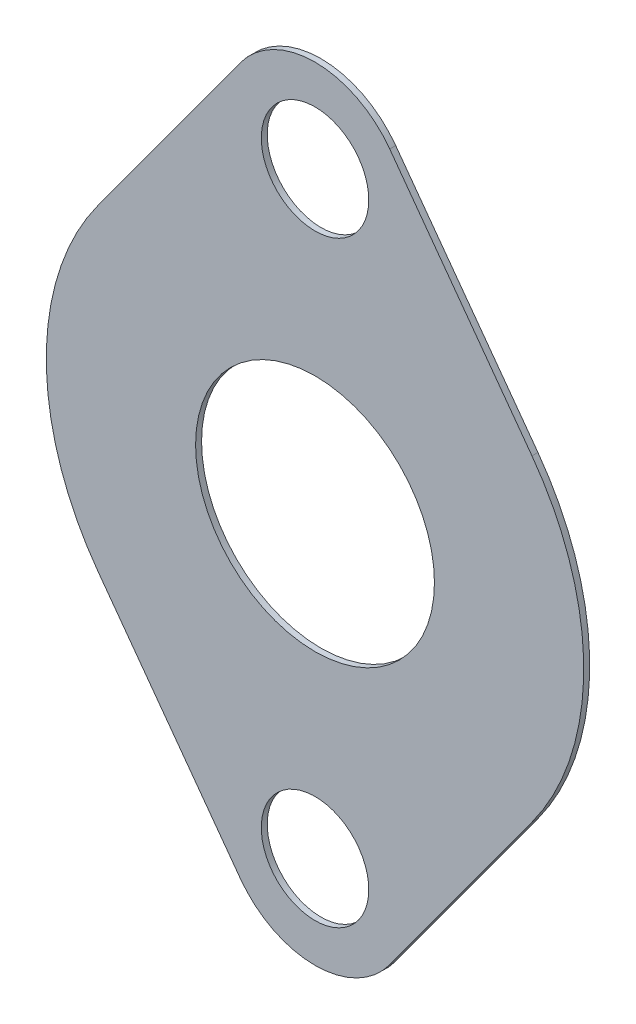
ISO-10303-21;
HEADER;
FILE_DESCRIPTION(('STEP AP214'),'2;1');
FILE_NAME('part.step','',(''),(''),'','','');
FILE_SCHEMA(('AUTOMOTIVE_DESIGN { 1 0 10303 214 1 1 1 1 }'));
ENDSEC;
DATA;
#1=APPLICATION_CONTEXT('core data for automotive mechanical design processes');
#2=APPLICATION_PROTOCOL_DEFINITION('international standard','automotive_design',2000,#1);
#3=PRODUCT_CONTEXT('',#1,'mechanical');
#4=PRODUCT('Part','Part','',(#3));
#5=PRODUCT_RELATED_PRODUCT_CATEGORY('part','',(#4));
#6=PRODUCT_DEFINITION_FORMATION('','',#4);
#7=PRODUCT_DEFINITION_CONTEXT('part definition',#1,'design');
#8=PRODUCT_DEFINITION('design','',#6,#7);
#9=PRODUCT_DEFINITION_SHAPE('','',#8);
#10=(LENGTH_UNIT() NAMED_UNIT(*) SI_UNIT(.MILLI.,.METRE.));
#11=(NAMED_UNIT(*) PLANE_ANGLE_UNIT() SI_UNIT($,.RADIAN.));
#12=(NAMED_UNIT(*) SI_UNIT($,.STERADIAN.) SOLID_ANGLE_UNIT());
#13=UNCERTAINTY_MEASURE_WITH_UNIT(LENGTH_MEASURE(1.E-05),#10,'distance_accuracy_value','');
#14=(GEOMETRIC_REPRESENTATION_CONTEXT(3) GLOBAL_UNCERTAINTY_ASSIGNED_CONTEXT((#13)) GLOBAL_UNIT_ASSIGNED_CONTEXT((#10,
#11,#12)) REPRESENTATION_CONTEXT('',''));
#15=CARTESIAN_POINT('',(0.,0.,0.));
#16=DIRECTION('',(0.,0.,1.));
#17=DIRECTION('',(1.,0.,0.));
#18=AXIS2_PLACEMENT_3D('',#15,#16,#17);
#19=CARTESIAN_POINT('',(0.,50.,1.));
#20=DIRECTION('',(0.,0.,1.));
#21=DIRECTION('',(1.,0.,0.));
#22=AXIS2_PLACEMENT_3D('',#19,#20,#21);
#23=PLANE('',#22);
#24=CARTESIAN_POINT('',(0.,-50.,1.));
#25=DIRECTION('',(0.,0.,1.));
#26=DIRECTION('',(1.,0.,0.));
#27=AXIS2_PLACEMENT_3D('',#24,#25,#26);
#28=CIRCLE('',#27,9.00000000000001);
#29=CARTESIAN_POINT('',(9.00000000000001,-50.,1.));
#30=VERTEX_POINT('',#29);
#31=EDGE_CURVE('E190',#30,#30,#28,.T.);
#32=ORIENTED_EDGE('',*,*,#31,.F.);
#33=EDGE_LOOP('',(#32));
#34=FACE_BOUND('',#33,.T.);
#35=CARTESIAN_POINT('',(0.,50.,1.));
#36=DIRECTION('',(0.,0.,1.));
#37=DIRECTION('',(1.,0.,0.));
#38=AXIS2_PLACEMENT_3D('',#35,#36,#37);
#39=CIRCLE('',#38,15.5);
#40=CARTESIAN_POINT('',(12.5147502971494,59.145,1.));
#41=VERTEX_POINT('',#40);
#42=CARTESIAN_POINT('',(-12.5147502971494,59.145,1.));
#43=VERTEX_POINT('',#42);
#44=EDGE_CURVE('E153',#41,#43,#39,.T.);
#45=ORIENTED_EDGE('',*,*,#44,.T.);
#46=DIRECTION('',(-0.589999999999999,-0.807403244977379,0.));
#47=VECTOR('',#46,1.);
#48=CARTESIAN_POINT('',(-12.5147502971494,59.145,1.));
#49=LINE('',#48,#47);
#50=CARTESIAN_POINT('',(-36.333146023982,26.5499999999999,1.));
#51=VERTEX_POINT('',#50);
#52=EDGE_CURVE('E101',#43,#51,#49,.T.);
#53=ORIENTED_EDGE('',*,*,#52,.T.);
#54=CARTESIAN_POINT('',(0.,0.,1.));
#55=DIRECTION('',(0.,0.,1.));
#56=DIRECTION('',(1.,0.,0.));
#57=AXIS2_PLACEMENT_3D('',#54,#55,#56);
#58=CIRCLE('',#57,45.);
#59=CARTESIAN_POINT('',(-36.333146023982,-26.5499999999999,1.));
#60=VERTEX_POINT('',#59);
#61=EDGE_CURVE('E168',#51,#60,#58,.T.);
#62=ORIENTED_EDGE('',*,*,#61,.T.);
#63=DIRECTION('',(0.589999999999999,-0.807403244977379,0.));
#64=VECTOR('',#63,1.);
#65=CARTESIAN_POINT('',(-36.333146023982,-26.5499999999999,1.));
#66=LINE('',#65,#64);
#67=CARTESIAN_POINT('',(-12.5147502971494,-59.145,1.));
#68=VERTEX_POINT('',#67);
#69=EDGE_CURVE('E181',#60,#68,#66,.T.);
#70=ORIENTED_EDGE('',*,*,#69,.T.);
#71=CARTESIAN_POINT('',(0.,-50.,1.));
#72=DIRECTION('',(0.,0.,1.));
#73=DIRECTION('',(1.,0.,0.));
#74=AXIS2_PLACEMENT_3D('',#71,#72,#73);
#75=CIRCLE('',#74,15.5);
#76=CARTESIAN_POINT('',(12.5147502971494,-59.145,1.));
#77=VERTEX_POINT('',#76);
#78=EDGE_CURVE('E120',#68,#77,#75,.T.);
#79=ORIENTED_EDGE('',*,*,#78,.T.);
#80=DIRECTION('',(0.589999999999999,0.807403244977379,0.));
#81=VECTOR('',#80,1.);
#82=CARTESIAN_POINT('',(12.5147502971494,-59.145,1.));
#83=LINE('',#82,#81);
#84=CARTESIAN_POINT('',(36.333146023982,-26.5499999999999,1.));
#85=VERTEX_POINT('',#84);
#86=EDGE_CURVE('E114',#77,#85,#83,.T.);
#87=ORIENTED_EDGE('',*,*,#86,.T.);
#88=CARTESIAN_POINT('',(0.,0.,1.));
#89=DIRECTION('',(0.,0.,1.));
#90=DIRECTION('',(1.,0.,0.));
#91=AXIS2_PLACEMENT_3D('',#88,#89,#90);
#92=CIRCLE('',#91,45.);
#93=CARTESIAN_POINT('',(36.333146023982,26.5499999999999,1.));
#94=VERTEX_POINT('',#93);
#95=EDGE_CURVE('E118',#85,#94,#92,.T.);
#96=ORIENTED_EDGE('',*,*,#95,.T.);
#97=DIRECTION('',(-0.589999999999999,0.807403244977379,0.));
#98=VECTOR('',#97,1.);
#99=CARTESIAN_POINT('',(36.333146023982,26.5499999999999,1.));
#100=LINE('',#99,#98);
#101=EDGE_CURVE('E58',#94,#41,#100,.T.);
#102=ORIENTED_EDGE('',*,*,#101,.T.);
#103=EDGE_LOOP('',(#45,#53,#62,#70,#79,#87,#96,#102));
#104=FACE_BOUND('',#103,.T.);
#105=CARTESIAN_POINT('',(0.,0.,1.));
#106=DIRECTION('',(0.,0.,1.));
#107=DIRECTION('',(1.,0.,0.));
#108=AXIS2_PLACEMENT_3D('',#105,#106,#107);
#109=CIRCLE('',#108,20.);
#110=CARTESIAN_POINT('',(20.,0.,1.));
#111=VERTEX_POINT('',#110);
#112=EDGE_CURVE('E142',#111,#111,#109,.T.);
#113=ORIENTED_EDGE('',*,*,#112,.F.);
#114=EDGE_LOOP('',(#113));
#115=FACE_BOUND('',#114,.T.);
#116=CARTESIAN_POINT('',(0.,50.,1.));
#117=DIRECTION('',(0.,0.,1.));
#118=DIRECTION('',(1.,0.,0.));
#119=AXIS2_PLACEMENT_3D('',#116,#117,#118);
#120=CIRCLE('',#119,9.);
#121=CARTESIAN_POINT('',(9.,50.,1.));
#122=VERTEX_POINT('',#121);
#123=EDGE_CURVE('E196',#122,#122,#120,.T.);
#124=ORIENTED_EDGE('',*,*,#123,.F.);
#125=EDGE_LOOP('',(#124));
#126=FACE_BOUND('',#125,.T.);
#127=ADVANCED_FACE('F41',(#34,#104,#115,#126),#23,.T.);
#128=CARTESIAN_POINT('',(0.,50.,0.));
#129=DIRECTION('',(0.,0.,1.));
#130=DIRECTION('',(1.,0.,0.));
#131=AXIS2_PLACEMENT_3D('',#128,#129,#130);
#132=PLANE('',#131);
#133=CARTESIAN_POINT('',(0.,-50.,0.));
#134=DIRECTION('',(0.,0.,1.));
#135=DIRECTION('',(1.,0.,0.));
#136=AXIS2_PLACEMENT_3D('',#133,#134,#135);
#137=CIRCLE('',#136,9.00000000000001);
#138=CARTESIAN_POINT('',(9.00000000000001,-50.,0.));
#139=VERTEX_POINT('',#138);
#140=EDGE_CURVE('E193',#139,#139,#137,.T.);
#141=ORIENTED_EDGE('',*,*,#140,.T.);
#142=EDGE_LOOP('',(#141));
#143=FACE_BOUND('',#142,.T.);
#144=CARTESIAN_POINT('',(0.,50.,0.));
#145=DIRECTION('',(0.,0.,1.));
#146=DIRECTION('',(1.,0.,0.));
#147=AXIS2_PLACEMENT_3D('',#144,#145,#146);
#148=CIRCLE('',#147,15.5);
#149=CARTESIAN_POINT('',(12.5147502971494,59.145,0.));
#150=VERTEX_POINT('',#149);
#151=CARTESIAN_POINT('',(-12.5147502971494,59.145,0.));
#152=VERTEX_POINT('',#151);
#153=EDGE_CURVE('E138',#150,#152,#148,.T.);
#154=ORIENTED_EDGE('',*,*,#153,.F.);
#155=DIRECTION('',(-0.589999999999999,0.807403244977379,0.));
#156=VECTOR('',#155,1.);
#157=CARTESIAN_POINT('',(36.333146023982,26.5499999999999,0.));
#158=LINE('',#157,#156);
#159=CARTESIAN_POINT('',(36.333146023982,26.5499999999999,0.));
#160=VERTEX_POINT('',#159);
#161=EDGE_CURVE('E93',#160,#150,#158,.T.);
#162=ORIENTED_EDGE('',*,*,#161,.F.);
#163=CARTESIAN_POINT('',(0.,0.,0.));
#164=DIRECTION('',(0.,0.,1.));
#165=DIRECTION('',(1.,0.,0.));
#166=AXIS2_PLACEMENT_3D('',#163,#164,#165);
#167=CIRCLE('',#166,45.);
#168=CARTESIAN_POINT('',(36.333146023982,-26.5499999999999,0.));
#169=VERTEX_POINT('',#168);
#170=EDGE_CURVE('E87',#169,#160,#167,.T.);
#171=ORIENTED_EDGE('',*,*,#170,.F.);
#172=DIRECTION('',(0.589999999999999,0.807403244977379,0.));
#173=VECTOR('',#172,1.);
#174=CARTESIAN_POINT('',(12.5147502971494,-59.145,0.));
#175=LINE('',#174,#173);
#176=CARTESIAN_POINT('',(12.5147502971494,-59.145,0.));
#177=VERTEX_POINT('',#176);
#178=EDGE_CURVE('E128',#177,#169,#175,.T.);
#179=ORIENTED_EDGE('',*,*,#178,.F.);
#180=CARTESIAN_POINT('',(0.,-50.,0.));
#181=DIRECTION('',(0.,0.,1.));
#182=DIRECTION('',(1.,0.,0.));
#183=AXIS2_PLACEMENT_3D('',#180,#181,#182);
#184=CIRCLE('',#183,15.5);
#185=CARTESIAN_POINT('',(-12.5147502971494,-59.145,0.));
#186=VERTEX_POINT('',#185);
#187=EDGE_CURVE('E148',#186,#177,#184,.T.);
#188=ORIENTED_EDGE('',*,*,#187,.F.);
#189=DIRECTION('',(0.589999999999999,-0.807403244977379,0.));
#190=VECTOR('',#189,1.);
#191=CARTESIAN_POINT('',(-36.333146023982,-26.5499999999999,0.));
#192=LINE('',#191,#190);
#193=CARTESIAN_POINT('',(-36.333146023982,-26.5499999999999,0.));
#194=VERTEX_POINT('',#193);
#195=EDGE_CURVE('E146',#194,#186,#192,.T.);
#196=ORIENTED_EDGE('',*,*,#195,.F.);
#197=CARTESIAN_POINT('',(0.,0.,0.));
#198=DIRECTION('',(0.,0.,1.));
#199=DIRECTION('',(1.,0.,0.));
#200=AXIS2_PLACEMENT_3D('',#197,#198,#199);
#201=CIRCLE('',#200,45.);
#202=CARTESIAN_POINT('',(-36.333146023982,26.5499999999999,0.));
#203=VERTEX_POINT('',#202);
#204=EDGE_CURVE('E144',#203,#194,#201,.T.);
#205=ORIENTED_EDGE('',*,*,#204,.F.);
#206=DIRECTION('',(-0.589999999999999,-0.807403244977379,0.));
#207=VECTOR('',#206,1.);
#208=CARTESIAN_POINT('',(-12.5147502971494,59.145,0.));
#209=LINE('',#208,#207);
#210=EDGE_CURVE('E141',#152,#203,#209,.T.);
#211=ORIENTED_EDGE('',*,*,#210,.F.);
#212=EDGE_LOOP('',(#154,#162,#171,#179,#188,#196,#205,#211));
#213=FACE_BOUND('',#212,.T.);
#214=CARTESIAN_POINT('',(0.,0.,0.));
#215=DIRECTION('',(0.,0.,1.));
#216=DIRECTION('',(1.,0.,0.));
#217=AXIS2_PLACEMENT_3D('',#214,#215,#216);
#218=CIRCLE('',#217,20.);
#219=CARTESIAN_POINT('',(20.,0.,0.));
#220=VERTEX_POINT('',#219);
#221=EDGE_CURVE('E187',#220,#220,#218,.T.);
#222=ORIENTED_EDGE('',*,*,#221,.T.);
#223=EDGE_LOOP('',(#222));
#224=FACE_BOUND('',#223,.T.);
#225=CARTESIAN_POINT('',(0.,50.,0.));
#226=DIRECTION('',(0.,0.,1.));
#227=DIRECTION('',(1.,0.,0.));
#228=AXIS2_PLACEMENT_3D('',#225,#226,#227);
#229=CIRCLE('',#228,9.);
#230=CARTESIAN_POINT('',(9.,50.,0.));
#231=VERTEX_POINT('',#230);
#232=EDGE_CURVE('E199',#231,#231,#229,.T.);
#233=ORIENTED_EDGE('',*,*,#232,.T.);
#234=EDGE_LOOP('',(#233));
#235=FACE_BOUND('',#234,.T.);
#236=ADVANCED_FACE('F172',(#143,#213,#224,#235),#132,.F.);
#237=CARTESIAN_POINT('',(0.,50.,1.));
#238=DIRECTION('',(0.,0.,-1.));
#239=DIRECTION('',(-1.,0.,0.));
#240=AXIS2_PLACEMENT_3D('',#237,#238,#239);
#241=CYLINDRICAL_SURFACE('',#240,15.5);
#242=ORIENTED_EDGE('',*,*,#153,.T.);
#243=DIRECTION('',(0.,0.,-1.));
#244=VECTOR('',#243,1.);
#245=CARTESIAN_POINT('',(-12.5147502971494,59.145,1.));
#246=LINE('',#245,#244);
#247=EDGE_CURVE('E11',#43,#152,#246,.T.);
#248=ORIENTED_EDGE('',*,*,#247,.F.);
#249=ORIENTED_EDGE('',*,*,#44,.F.);
#250=DIRECTION('',(0.,0.,-1.));
#251=VECTOR('',#250,1.);
#252=CARTESIAN_POINT('',(12.5147502971494,59.145,1.));
#253=LINE('',#252,#251);
#254=EDGE_CURVE('E134',#41,#150,#253,.T.);
#255=ORIENTED_EDGE('',*,*,#254,.T.);
#256=EDGE_LOOP('',(#242,#248,#249,#255));
#257=FACE_BOUND('',#256,.T.);
#258=ADVANCED_FACE('F43',(#257),#241,.T.);
#259=CARTESIAN_POINT('',(-12.5147502971494,59.145,1.));
#260=DIRECTION('',(0.807403244977379,-0.589999999999999,0.));
#261=DIRECTION('',(0.589999999999999,0.807403244977379,0.));
#262=AXIS2_PLACEMENT_3D('',#259,#260,#261);
#263=PLANE('',#262);
#264=ORIENTED_EDGE('',*,*,#210,.T.);
#265=DIRECTION('',(0.,0.,-1.));
#266=VECTOR('',#265,1.);
#267=CARTESIAN_POINT('',(-36.333146023982,26.5499999999999,1.));
#268=LINE('',#267,#266);
#269=EDGE_CURVE('E50',#51,#203,#268,.T.);
#270=ORIENTED_EDGE('',*,*,#269,.F.);
#271=ORIENTED_EDGE('',*,*,#52,.F.);
#272=ORIENTED_EDGE('',*,*,#247,.T.);
#273=EDGE_LOOP('',(#264,#270,#271,#272));
#274=FACE_BOUND('',#273,.T.);
#275=ADVANCED_FACE('F233',(#274),#263,.F.);
#276=CARTESIAN_POINT('',(0.,0.,1.));
#277=DIRECTION('',(0.,0.,-1.));
#278=DIRECTION('',(-1.,0.,0.));
#279=AXIS2_PLACEMENT_3D('',#276,#277,#278);
#280=CYLINDRICAL_SURFACE('',#279,45.);
#281=ORIENTED_EDGE('',*,*,#204,.T.);
#282=DIRECTION('',(0.,0.,-1.));
#283=VECTOR('',#282,1.);
#284=CARTESIAN_POINT('',(-36.333146023982,-26.5499999999999,1.));
#285=LINE('',#284,#283);
#286=EDGE_CURVE('E160',#60,#194,#285,.T.);
#287=ORIENTED_EDGE('',*,*,#286,.F.);
#288=ORIENTED_EDGE('',*,*,#61,.F.);
#289=ORIENTED_EDGE('',*,*,#269,.T.);
#290=EDGE_LOOP('',(#281,#287,#288,#289));
#291=FACE_BOUND('',#290,.T.);
#292=ADVANCED_FACE('F166',(#291),#280,.T.);
#293=CARTESIAN_POINT('',(-36.333146023982,-26.5499999999999,1.));
#294=DIRECTION('',(0.807403244977379,0.589999999999999,0.));
#295=DIRECTION('',(-0.589999999999999,0.807403244977379,0.));
#296=AXIS2_PLACEMENT_3D('',#293,#294,#295);
#297=PLANE('',#296);
#298=ORIENTED_EDGE('',*,*,#195,.T.);
#299=DIRECTION('',(0.,0.,-1.));
#300=VECTOR('',#299,1.);
#301=CARTESIAN_POINT('',(-12.5147502971494,-59.145,1.));
#302=LINE('',#301,#300);
#303=EDGE_CURVE('E157',#68,#186,#302,.T.);
#304=ORIENTED_EDGE('',*,*,#303,.F.);
#305=ORIENTED_EDGE('',*,*,#69,.F.);
#306=ORIENTED_EDGE('',*,*,#286,.T.);
#307=EDGE_LOOP('',(#298,#304,#305,#306));
#308=FACE_BOUND('',#307,.T.);
#309=ADVANCED_FACE('F177',(#308),#297,.F.);
#310=CARTESIAN_POINT('',(0.,-50.,1.));
#311=DIRECTION('',(0.,0.,-1.));
#312=DIRECTION('',(-1.,0.,0.));
#313=AXIS2_PLACEMENT_3D('',#310,#311,#312);
#314=CYLINDRICAL_SURFACE('',#313,15.5);
#315=ORIENTED_EDGE('',*,*,#187,.T.);
#316=DIRECTION('',(0.,0.,-1.));
#317=VECTOR('',#316,1.);
#318=CARTESIAN_POINT('',(12.5147502971494,-59.145,1.));
#319=LINE('',#318,#317);
#320=EDGE_CURVE('E129',#77,#177,#319,.T.);
#321=ORIENTED_EDGE('',*,*,#320,.F.);
#322=ORIENTED_EDGE('',*,*,#78,.F.);
#323=ORIENTED_EDGE('',*,*,#303,.T.);
#324=EDGE_LOOP('',(#315,#321,#322,#323));
#325=FACE_BOUND('',#324,.T.);
#326=ADVANCED_FACE('F180',(#325),#314,.T.);
#327=CARTESIAN_POINT('',(12.5147502971494,-59.145,1.));
#328=DIRECTION('',(-0.807403244977379,0.589999999999999,0.));
#329=DIRECTION('',(-0.589999999999999,-0.807403244977379,0.));
#330=AXIS2_PLACEMENT_3D('',#327,#328,#329);
#331=PLANE('',#330);
#332=ORIENTED_EDGE('',*,*,#178,.T.);
#333=DIRECTION('',(0.,0.,-1.));
#334=VECTOR('',#333,1.);
#335=CARTESIAN_POINT('',(36.333146023982,-26.5499999999999,1.));
#336=LINE('',#335,#334);
#337=EDGE_CURVE('E125',#85,#169,#336,.T.);
#338=ORIENTED_EDGE('',*,*,#337,.F.);
#339=ORIENTED_EDGE('',*,*,#86,.F.);
#340=ORIENTED_EDGE('',*,*,#320,.T.);
#341=EDGE_LOOP('',(#332,#338,#339,#340));
#342=FACE_BOUND('',#341,.T.);
#343=ADVANCED_FACE('F126',(#342),#331,.F.);
#344=CARTESIAN_POINT('',(0.,0.,1.));
#345=DIRECTION('',(0.,0.,-1.));
#346=DIRECTION('',(-1.,0.,0.));
#347=AXIS2_PLACEMENT_3D('',#344,#345,#346);
#348=CYLINDRICAL_SURFACE('',#347,45.);
#349=ORIENTED_EDGE('',*,*,#170,.T.);
#350=DIRECTION('',(0.,0.,-1.));
#351=VECTOR('',#350,1.);
#352=CARTESIAN_POINT('',(36.333146023982,26.5499999999999,1.));
#353=LINE('',#352,#351);
#354=EDGE_CURVE('E130',#94,#160,#353,.T.);
#355=ORIENTED_EDGE('',*,*,#354,.F.);
#356=ORIENTED_EDGE('',*,*,#95,.F.);
#357=ORIENTED_EDGE('',*,*,#337,.T.);
#358=EDGE_LOOP('',(#349,#355,#356,#357));
#359=FACE_BOUND('',#358,.T.);
#360=ADVANCED_FACE('F132',(#359),#348,.T.);
#361=CARTESIAN_POINT('',(36.333146023982,26.5499999999999,1.));
#362=DIRECTION('',(-0.807403244977379,-0.589999999999999,0.));
#363=DIRECTION('',(0.589999999999999,-0.807403244977379,0.));
#364=AXIS2_PLACEMENT_3D('',#361,#362,#363);
#365=PLANE('',#364);
#366=ORIENTED_EDGE('',*,*,#161,.T.);
#367=ORIENTED_EDGE('',*,*,#254,.F.);
#368=ORIENTED_EDGE('',*,*,#101,.F.);
#369=ORIENTED_EDGE('',*,*,#354,.T.);
#370=EDGE_LOOP('',(#366,#367,#368,#369));
#371=FACE_BOUND('',#370,.T.);
#372=ADVANCED_FACE('F221',(#371),#365,.F.);
#373=CARTESIAN_POINT('',(0.,0.,1.));
#374=DIRECTION('',(0.,0.,-1.));
#375=DIRECTION('',(-1.,0.,0.));
#376=AXIS2_PLACEMENT_3D('',#373,#374,#375);
#377=CYLINDRICAL_SURFACE('',#376,20.);
#378=ORIENTED_EDGE('',*,*,#112,.T.);
#379=EDGE_LOOP('',(#378));
#380=FACE_BOUND('',#379,.T.);
#381=ORIENTED_EDGE('',*,*,#221,.F.);
#382=EDGE_LOOP('',(#381));
#383=FACE_BOUND('',#382,.T.);
#384=ADVANCED_FACE('F218',(#380,#383),#377,.F.);
#385=CARTESIAN_POINT('',(0.,-50.,1.));
#386=DIRECTION('',(0.,0.,-1.));
#387=DIRECTION('',(-1.,0.,0.));
#388=AXIS2_PLACEMENT_3D('',#385,#386,#387);
#389=CYLINDRICAL_SURFACE('',#388,9.00000000000001);
#390=ORIENTED_EDGE('',*,*,#31,.T.);
#391=EDGE_LOOP('',(#390));
#392=FACE_BOUND('',#391,.T.);
#393=ORIENTED_EDGE('',*,*,#140,.F.);
#394=EDGE_LOOP('',(#393));
#395=FACE_BOUND('',#394,.T.);
#396=ADVANCED_FACE('F282',(#392,#395),#389,.F.);
#397=CARTESIAN_POINT('',(0.,50.,1.));
#398=DIRECTION('',(0.,0.,-1.));
#399=DIRECTION('',(-1.,0.,0.));
#400=AXIS2_PLACEMENT_3D('',#397,#398,#399);
#401=CYLINDRICAL_SURFACE('',#400,9.);
#402=ORIENTED_EDGE('',*,*,#123,.T.);
#403=EDGE_LOOP('',(#402));
#404=FACE_BOUND('',#403,.T.);
#405=ORIENTED_EDGE('',*,*,#232,.F.);
#406=EDGE_LOOP('',(#405));
#407=FACE_BOUND('',#406,.T.);
#408=ADVANCED_FACE('F205',(#404,#407),#401,.F.);
#409=CLOSED_SHELL('',(#127,#236,#258,#275,#292,#309,#326,#343,#360,#372,#384,#396,#408));
#410=MANIFOLD_SOLID_BREP('B2',#409);
#411=ADVANCED_BREP_SHAPE_REPRESENTATION('',(#18,#410),#14);
#412=SHAPE_DEFINITION_REPRESENTATION(#9,#411);
ENDSEC;
END-ISO-10303-21;
